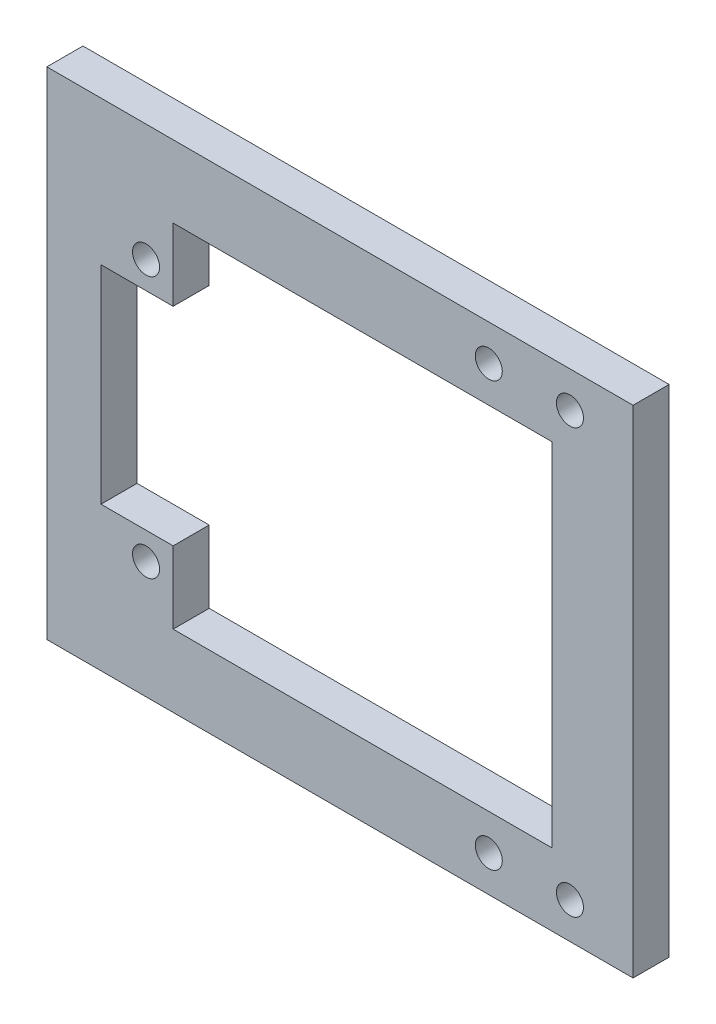
ISO-10303-21;
HEADER;
FILE_DESCRIPTION(('STEP AP214'),'2;1');
FILE_NAME('part.step','',(''),(''),'','','');
FILE_SCHEMA(('AUTOMOTIVE_DESIGN { 1 0 10303 214 1 1 1 1 }'));
ENDSEC;
DATA;
#1=APPLICATION_CONTEXT('core data for automotive mechanical design processes');
#2=APPLICATION_PROTOCOL_DEFINITION('international standard','automotive_design',2000,#1);
#3=PRODUCT_CONTEXT('',#1,'mechanical');
#4=PRODUCT('Part','Part','',(#3));
#5=PRODUCT_RELATED_PRODUCT_CATEGORY('part','',(#4));
#6=PRODUCT_DEFINITION_FORMATION('','',#4);
#7=PRODUCT_DEFINITION_CONTEXT('part definition',#1,'design');
#8=PRODUCT_DEFINITION('design','',#6,#7);
#9=PRODUCT_DEFINITION_SHAPE('','',#8);
#10=(LENGTH_UNIT() NAMED_UNIT(*) SI_UNIT(.MILLI.,.METRE.));
#11=(NAMED_UNIT(*) PLANE_ANGLE_UNIT() SI_UNIT($,.RADIAN.));
#12=(NAMED_UNIT(*) SI_UNIT($,.STERADIAN.) SOLID_ANGLE_UNIT());
#13=UNCERTAINTY_MEASURE_WITH_UNIT(LENGTH_MEASURE(1.E-05),#10,'distance_accuracy_value','');
#14=(GEOMETRIC_REPRESENTATION_CONTEXT(3) GLOBAL_UNCERTAINTY_ASSIGNED_CONTEXT((#13)) GLOBAL_UNIT_ASSIGNED_CONTEXT((#10,
#11,#12)) REPRESENTATION_CONTEXT('',''));
#15=CARTESIAN_POINT('',(0.,0.,0.));
#16=DIRECTION('',(0.,0.,1.));
#17=DIRECTION('',(1.,0.,0.));
#18=AXIS2_PLACEMENT_3D('',#15,#16,#17);
#19=CARTESIAN_POINT('',(0.,0.,4.));
#20=DIRECTION('',(0.,0.,-1.));
#21=DIRECTION('',(-1.,0.,0.));
#22=AXIS2_PLACEMENT_3D('',#19,#20,#21);
#23=PLANE('',#22);
#24=CARTESIAN_POINT('',(25.5,-23.5,4.));
#25=DIRECTION('',(0.,0.,1.));
#26=DIRECTION('',(1.,0.,0.));
#27=AXIS2_PLACEMENT_3D('',#24,#25,#26);
#28=CIRCLE('',#27,1.5);
#29=CARTESIAN_POINT('',(27.,-23.5,4.));
#30=VERTEX_POINT('',#29);
#31=EDGE_CURVE('E191',#30,#30,#28,.T.);
#32=ORIENTED_EDGE('',*,*,#31,.F.);
#33=EDGE_LOOP('',(#32));
#34=FACE_BOUND('',#33,.T.);
#35=CARTESIAN_POINT('',(16.5,-23.5,4.));
#36=DIRECTION('',(0.,0.,1.));
#37=DIRECTION('',(1.,0.,0.));
#38=AXIS2_PLACEMENT_3D('',#35,#36,#37);
#39=CIRCLE('',#38,1.5);
#40=CARTESIAN_POINT('',(18.,-23.5,4.));
#41=VERTEX_POINT('',#40);
#42=EDGE_CURVE('E197',#41,#41,#39,.T.);
#43=ORIENTED_EDGE('',*,*,#42,.F.);
#44=EDGE_LOOP('',(#43));
#45=FACE_BOUND('',#44,.T.);
#46=CARTESIAN_POINT('',(25.5,23.5,4.));
#47=DIRECTION('',(0.,0.,1.));
#48=DIRECTION('',(1.,0.,0.));
#49=AXIS2_PLACEMENT_3D('',#46,#47,#48);
#50=CIRCLE('',#49,1.5);
#51=CARTESIAN_POINT('',(27.,23.5,4.));
#52=VERTEX_POINT('',#51);
#53=EDGE_CURVE('E203',#52,#52,#50,.T.);
#54=ORIENTED_EDGE('',*,*,#53,.F.);
#55=EDGE_LOOP('',(#54));
#56=FACE_BOUND('',#55,.T.);
#57=CARTESIAN_POINT('',(16.5,23.5,4.));
#58=DIRECTION('',(0.,0.,1.));
#59=DIRECTION('',(1.,0.,0.));
#60=AXIS2_PLACEMENT_3D('',#57,#58,#59);
#61=CIRCLE('',#60,1.5);
#62=CARTESIAN_POINT('',(18.,23.5,4.));
#63=VERTEX_POINT('',#62);
#64=EDGE_CURVE('E209',#63,#63,#61,.T.);
#65=ORIENTED_EDGE('',*,*,#64,.F.);
#66=EDGE_LOOP('',(#65));
#67=FACE_BOUND('',#66,.T.);
#68=CARTESIAN_POINT('',(-21.5,-14.5,4.));
#69=DIRECTION('',(0.,0.,1.));
#70=DIRECTION('',(1.,0.,0.));
#71=AXIS2_PLACEMENT_3D('',#68,#69,#70);
#72=CIRCLE('',#71,1.5);
#73=CARTESIAN_POINT('',(-20.,-14.5,4.));
#74=VERTEX_POINT('',#73);
#75=EDGE_CURVE('E215',#74,#74,#72,.T.);
#76=ORIENTED_EDGE('',*,*,#75,.F.);
#77=EDGE_LOOP('',(#76));
#78=FACE_BOUND('',#77,.T.);
#79=CARTESIAN_POINT('',(-21.5,14.5,4.));
#80=DIRECTION('',(0.,0.,1.));
#81=DIRECTION('',(1.,0.,0.));
#82=AXIS2_PLACEMENT_3D('',#79,#80,#81);
#83=CIRCLE('',#82,1.5);
#84=CARTESIAN_POINT('',(-20.,14.5,4.));
#85=VERTEX_POINT('',#84);
#86=EDGE_CURVE('E221',#85,#85,#83,.T.);
#87=ORIENTED_EDGE('',*,*,#86,.F.);
#88=EDGE_LOOP('',(#87));
#89=FACE_BOUND('',#88,.T.);
#90=DIRECTION('',(-1.,0.,0.));
#91=VECTOR('',#90,1.);
#92=CARTESIAN_POINT('',(-32.5,27.5,4.));
#93=LINE('',#92,#91);
#94=CARTESIAN_POINT('',(32.5,27.5,4.));
#95=VERTEX_POINT('',#94);
#96=CARTESIAN_POINT('',(-32.5,27.5,4.));
#97=VERTEX_POINT('',#96);
#98=EDGE_CURVE('E227',#95,#97,#93,.T.);
#99=ORIENTED_EDGE('',*,*,#98,.T.);
#100=DIRECTION('',(0.,-1.,0.));
#101=VECTOR('',#100,1.);
#102=CARTESIAN_POINT('',(-32.5,-27.5,4.));
#103=LINE('',#102,#101);
#104=CARTESIAN_POINT('',(-32.5,-27.5,4.));
#105=VERTEX_POINT('',#104);
#106=EDGE_CURVE('E230',#97,#105,#103,.T.);
#107=ORIENTED_EDGE('',*,*,#106,.T.);
#108=DIRECTION('',(1.,0.,0.));
#109=VECTOR('',#108,1.);
#110=CARTESIAN_POINT('',(32.5,-27.5,4.));
#111=LINE('',#110,#109);
#112=CARTESIAN_POINT('',(32.5,-27.5,4.));
#113=VERTEX_POINT('',#112);
#114=EDGE_CURVE('E233',#105,#113,#111,.T.);
#115=ORIENTED_EDGE('',*,*,#114,.T.);
#116=DIRECTION('',(0.,1.,0.));
#117=VECTOR('',#116,1.);
#118=CARTESIAN_POINT('',(32.5,27.5,4.));
#119=LINE('',#118,#117);
#120=EDGE_CURVE('E235',#113,#95,#119,.T.);
#121=ORIENTED_EDGE('',*,*,#120,.T.);
#122=EDGE_LOOP('',(#99,#107,#115,#121));
#123=FACE_BOUND('',#122,.T.);
#124=DIRECTION('',(1.,0.,0.));
#125=VECTOR('',#124,1.);
#126=CARTESIAN_POINT('',(-18.5,-19.5,4.));
#127=LINE('',#126,#125);
#128=CARTESIAN_POINT('',(-18.5,-19.5,4.));
#129=VERTEX_POINT('',#128);
#130=CARTESIAN_POINT('',(23.5,-19.5,4.));
#131=VERTEX_POINT('',#130);
#132=EDGE_CURVE('E126',#129,#131,#127,.T.);
#133=ORIENTED_EDGE('',*,*,#132,.F.);
#134=DIRECTION('',(0.,-1.,0.));
#135=VECTOR('',#134,1.);
#136=CARTESIAN_POINT('',(-18.5,-11.5,4.));
#137=LINE('',#136,#135);
#138=CARTESIAN_POINT('',(-18.5,-11.5,4.));
#139=VERTEX_POINT('',#138);
#140=EDGE_CURVE('E159',#139,#129,#137,.T.);
#141=ORIENTED_EDGE('',*,*,#140,.F.);
#142=DIRECTION('',(1.,0.,0.));
#143=VECTOR('',#142,1.);
#144=CARTESIAN_POINT('',(-26.5,-11.5,4.));
#145=LINE('',#144,#143);
#146=CARTESIAN_POINT('',(-26.5,-11.5,4.));
#147=VERTEX_POINT('',#146);
#148=EDGE_CURVE('E157',#147,#139,#145,.T.);
#149=ORIENTED_EDGE('',*,*,#148,.F.);
#150=DIRECTION('',(0.,-1.,0.));
#151=VECTOR('',#150,1.);
#152=CARTESIAN_POINT('',(-26.5,11.5,4.));
#153=LINE('',#152,#151);
#154=CARTESIAN_POINT('',(-26.5,11.5,4.));
#155=VERTEX_POINT('',#154);
#156=EDGE_CURVE('E155',#155,#147,#153,.T.);
#157=ORIENTED_EDGE('',*,*,#156,.F.);
#158=DIRECTION('',(-1.,0.,0.));
#159=VECTOR('',#158,1.);
#160=CARTESIAN_POINT('',(-18.5,11.5,4.));
#161=LINE('',#160,#159);
#162=CARTESIAN_POINT('',(-18.5,11.5,4.));
#163=VERTEX_POINT('',#162);
#164=EDGE_CURVE('E153',#163,#155,#161,.T.);
#165=ORIENTED_EDGE('',*,*,#164,.F.);
#166=DIRECTION('',(0.,-1.,0.));
#167=VECTOR('',#166,1.);
#168=CARTESIAN_POINT('',(-18.5,19.5,4.));
#169=LINE('',#168,#167);
#170=CARTESIAN_POINT('',(-18.5,19.5,4.));
#171=VERTEX_POINT('',#170);
#172=EDGE_CURVE('E149',#171,#163,#169,.T.);
#173=ORIENTED_EDGE('',*,*,#172,.F.);
#174=DIRECTION('',(-1.,0.,0.));
#175=VECTOR('',#174,1.);
#176=CARTESIAN_POINT('',(23.5,19.5,4.));
#177=LINE('',#176,#175);
#178=CARTESIAN_POINT('',(23.5,19.5,4.));
#179=VERTEX_POINT('',#178);
#180=EDGE_CURVE('E147',#179,#171,#177,.T.);
#181=ORIENTED_EDGE('',*,*,#180,.F.);
#182=DIRECTION('',(0.,1.,0.));
#183=VECTOR('',#182,1.);
#184=CARTESIAN_POINT('',(23.5,-19.5,4.));
#185=LINE('',#184,#183);
#186=EDGE_CURVE('E134',#131,#179,#185,.T.);
#187=ORIENTED_EDGE('',*,*,#186,.F.);
#188=EDGE_LOOP('',(#133,#141,#149,#157,#165,#173,#181,#187));
#189=FACE_BOUND('',#188,.T.);
#190=ADVANCED_FACE('F37',(#34,#45,#56,#67,#78,#89,#123,#189),#23,.F.);
#191=CARTESIAN_POINT('',(0.,0.,0.));
#192=DIRECTION('',(0.,0.,-1.));
#193=DIRECTION('',(-1.,0.,0.));
#194=AXIS2_PLACEMENT_3D('',#191,#192,#193);
#195=PLANE('',#194);
#196=CARTESIAN_POINT('',(16.5,-23.5,0.));
#197=DIRECTION('',(0.,0.,1.));
#198=DIRECTION('',(1.,0.,0.));
#199=AXIS2_PLACEMENT_3D('',#196,#197,#198);
#200=CIRCLE('',#199,1.5);
#201=CARTESIAN_POINT('',(18.,-23.5,0.));
#202=VERTEX_POINT('',#201);
#203=EDGE_CURVE('E194',#202,#202,#200,.T.);
#204=ORIENTED_EDGE('',*,*,#203,.T.);
#205=EDGE_LOOP('',(#204));
#206=FACE_BOUND('',#205,.T.);
#207=CARTESIAN_POINT('',(16.5,23.5,0.));
#208=DIRECTION('',(0.,0.,1.));
#209=DIRECTION('',(1.,0.,0.));
#210=AXIS2_PLACEMENT_3D('',#207,#208,#209);
#211=CIRCLE('',#210,1.5);
#212=CARTESIAN_POINT('',(18.,23.5,0.));
#213=VERTEX_POINT('',#212);
#214=EDGE_CURVE('E206',#213,#213,#211,.T.);
#215=ORIENTED_EDGE('',*,*,#214,.T.);
#216=EDGE_LOOP('',(#215));
#217=FACE_BOUND('',#216,.T.);
#218=CARTESIAN_POINT('',(-21.5,14.5,0.));
#219=DIRECTION('',(0.,0.,1.));
#220=DIRECTION('',(1.,0.,0.));
#221=AXIS2_PLACEMENT_3D('',#218,#219,#220);
#222=CIRCLE('',#221,1.5);
#223=CARTESIAN_POINT('',(-20.,14.5,0.));
#224=VERTEX_POINT('',#223);
#225=EDGE_CURVE('E218',#224,#224,#222,.T.);
#226=ORIENTED_EDGE('',*,*,#225,.T.);
#227=EDGE_LOOP('',(#226));
#228=FACE_BOUND('',#227,.T.);
#229=DIRECTION('',(-1.,0.,0.));
#230=VECTOR('',#229,1.);
#231=CARTESIAN_POINT('',(-32.5,27.5,0.));
#232=LINE('',#231,#230);
#233=CARTESIAN_POINT('',(32.5,27.5,0.));
#234=VERTEX_POINT('',#233);
#235=CARTESIAN_POINT('',(-32.5,27.5,0.));
#236=VERTEX_POINT('',#235);
#237=EDGE_CURVE('E224',#234,#236,#232,.T.);
#238=ORIENTED_EDGE('',*,*,#237,.F.);
#239=DIRECTION('',(0.,1.,0.));
#240=VECTOR('',#239,1.);
#241=CARTESIAN_POINT('',(32.5,27.5,0.));
#242=LINE('',#241,#240);
#243=CARTESIAN_POINT('',(32.5,-27.5,0.));
#244=VERTEX_POINT('',#243);
#245=EDGE_CURVE('E231',#244,#234,#242,.T.);
#246=ORIENTED_EDGE('',*,*,#245,.F.);
#247=DIRECTION('',(1.,0.,0.));
#248=VECTOR('',#247,1.);
#249=CARTESIAN_POINT('',(32.5,-27.5,0.));
#250=LINE('',#249,#248);
#251=CARTESIAN_POINT('',(-32.5,-27.5,0.));
#252=VERTEX_POINT('',#251);
#253=EDGE_CURVE('E242',#252,#244,#250,.T.);
#254=ORIENTED_EDGE('',*,*,#253,.F.);
#255=DIRECTION('',(0.,-1.,0.));
#256=VECTOR('',#255,1.);
#257=CARTESIAN_POINT('',(-32.5,-27.5,0.));
#258=LINE('',#257,#256);
#259=EDGE_CURVE('E240',#236,#252,#258,.T.);
#260=ORIENTED_EDGE('',*,*,#259,.F.);
#261=EDGE_LOOP('',(#238,#246,#254,#260));
#262=FACE_BOUND('',#261,.T.);
#263=CARTESIAN_POINT('',(-21.5,-14.5,0.));
#264=DIRECTION('',(0.,0.,1.));
#265=DIRECTION('',(1.,0.,0.));
#266=AXIS2_PLACEMENT_3D('',#263,#264,#265);
#267=CIRCLE('',#266,1.5);
#268=CARTESIAN_POINT('',(-20.,-14.5,0.));
#269=VERTEX_POINT('',#268);
#270=EDGE_CURVE('E212',#269,#269,#267,.T.);
#271=ORIENTED_EDGE('',*,*,#270,.T.);
#272=EDGE_LOOP('',(#271));
#273=FACE_BOUND('',#272,.T.);
#274=CARTESIAN_POINT('',(25.5,23.5,0.));
#275=DIRECTION('',(0.,0.,1.));
#276=DIRECTION('',(1.,0.,0.));
#277=AXIS2_PLACEMENT_3D('',#274,#275,#276);
#278=CIRCLE('',#277,1.5);
#279=CARTESIAN_POINT('',(27.,23.5,0.));
#280=VERTEX_POINT('',#279);
#281=EDGE_CURVE('E200',#280,#280,#278,.T.);
#282=ORIENTED_EDGE('',*,*,#281,.T.);
#283=EDGE_LOOP('',(#282));
#284=FACE_BOUND('',#283,.T.);
#285=CARTESIAN_POINT('',(25.5,-23.5,0.));
#286=DIRECTION('',(0.,0.,1.));
#287=DIRECTION('',(1.,0.,0.));
#288=AXIS2_PLACEMENT_3D('',#285,#286,#287);
#289=CIRCLE('',#288,1.5);
#290=CARTESIAN_POINT('',(27.,-23.5,0.));
#291=VERTEX_POINT('',#290);
#292=EDGE_CURVE('E142',#291,#291,#289,.T.);
#293=ORIENTED_EDGE('',*,*,#292,.T.);
#294=EDGE_LOOP('',(#293));
#295=FACE_BOUND('',#294,.T.);
#296=DIRECTION('',(0.,-1.,0.));
#297=VECTOR('',#296,1.);
#298=CARTESIAN_POINT('',(-18.5,-11.5,0.));
#299=LINE('',#298,#297);
#300=CARTESIAN_POINT('',(-18.5,-11.5,0.));
#301=VERTEX_POINT('',#300);
#302=CARTESIAN_POINT('',(-18.5,-19.5,0.));
#303=VERTEX_POINT('',#302);
#304=EDGE_CURVE('E135',#301,#303,#299,.T.);
#305=ORIENTED_EDGE('',*,*,#304,.T.);
#306=DIRECTION('',(1.,0.,0.));
#307=VECTOR('',#306,1.);
#308=CARTESIAN_POINT('',(-18.5,-19.5,0.));
#309=LINE('',#308,#307);
#310=CARTESIAN_POINT('',(23.5,-19.5,0.));
#311=VERTEX_POINT('',#310);
#312=EDGE_CURVE('E60',#303,#311,#309,.T.);
#313=ORIENTED_EDGE('',*,*,#312,.T.);
#314=DIRECTION('',(0.,1.,0.));
#315=VECTOR('',#314,1.);
#316=CARTESIAN_POINT('',(23.5,-19.5,0.));
#317=LINE('',#316,#315);
#318=CARTESIAN_POINT('',(23.5,19.5,0.));
#319=VERTEX_POINT('',#318);
#320=EDGE_CURVE('E141',#311,#319,#317,.T.);
#321=ORIENTED_EDGE('',*,*,#320,.T.);
#322=DIRECTION('',(-1.,0.,0.));
#323=VECTOR('',#322,1.);
#324=CARTESIAN_POINT('',(23.5,19.5,0.));
#325=LINE('',#324,#323);
#326=CARTESIAN_POINT('',(-18.5,19.5,0.));
#327=VERTEX_POINT('',#326);
#328=EDGE_CURVE('E163',#319,#327,#325,.T.);
#329=ORIENTED_EDGE('',*,*,#328,.T.);
#330=DIRECTION('',(0.,-1.,0.));
#331=VECTOR('',#330,1.);
#332=CARTESIAN_POINT('',(-18.5,19.5,0.));
#333=LINE('',#332,#331);
#334=CARTESIAN_POINT('',(-18.5,11.5,0.));
#335=VERTEX_POINT('',#334);
#336=EDGE_CURVE('E166',#327,#335,#333,.T.);
#337=ORIENTED_EDGE('',*,*,#336,.T.);
#338=DIRECTION('',(-1.,0.,0.));
#339=VECTOR('',#338,1.);
#340=CARTESIAN_POINT('',(-18.5,11.5,0.));
#341=LINE('',#340,#339);
#342=CARTESIAN_POINT('',(-26.5,11.5,0.));
#343=VERTEX_POINT('',#342);
#344=EDGE_CURVE('E169',#335,#343,#341,.T.);
#345=ORIENTED_EDGE('',*,*,#344,.T.);
#346=DIRECTION('',(0.,-1.,0.));
#347=VECTOR('',#346,1.);
#348=CARTESIAN_POINT('',(-26.5,11.5,0.));
#349=LINE('',#348,#347);
#350=CARTESIAN_POINT('',(-26.5,-11.5,0.));
#351=VERTEX_POINT('',#350);
#352=EDGE_CURVE('E172',#343,#351,#349,.T.);
#353=ORIENTED_EDGE('',*,*,#352,.T.);
#354=DIRECTION('',(1.,0.,0.));
#355=VECTOR('',#354,1.);
#356=CARTESIAN_POINT('',(-26.5,-11.5,0.));
#357=LINE('',#356,#355);
#358=EDGE_CURVE('E175',#351,#301,#357,.T.);
#359=ORIENTED_EDGE('',*,*,#358,.T.);
#360=EDGE_LOOP('',(#305,#313,#321,#329,#337,#345,#353,#359));
#361=FACE_BOUND('',#360,.T.);
#362=ADVANCED_FACE('F260',(#206,#217,#228,#262,#273,#284,#295,#361),#195,.T.);
#363=CARTESIAN_POINT('',(-32.5,27.5,4.));
#364=DIRECTION('',(0.,-1.,0.));
#365=DIRECTION('',(1.,0.,0.));
#366=AXIS2_PLACEMENT_3D('',#363,#364,#365);
#367=PLANE('',#366);
#368=ORIENTED_EDGE('',*,*,#237,.T.);
#369=DIRECTION('',(0.,0.,-1.));
#370=VECTOR('',#369,1.);
#371=CARTESIAN_POINT('',(-32.5,27.5,4.));
#372=LINE('',#371,#370);
#373=EDGE_CURVE('E11',#97,#236,#372,.T.);
#374=ORIENTED_EDGE('',*,*,#373,.F.);
#375=ORIENTED_EDGE('',*,*,#98,.F.);
#376=DIRECTION('',(0.,0.,-1.));
#377=VECTOR('',#376,1.);
#378=CARTESIAN_POINT('',(32.5,27.5,4.));
#379=LINE('',#378,#377);
#380=EDGE_CURVE('E237',#95,#234,#379,.T.);
#381=ORIENTED_EDGE('',*,*,#380,.T.);
#382=EDGE_LOOP('',(#368,#374,#375,#381));
#383=FACE_BOUND('',#382,.T.);
#384=ADVANCED_FACE('F39',(#383),#367,.F.);
#385=CARTESIAN_POINT('',(-32.5,-27.5,4.));
#386=DIRECTION('',(1.,0.,0.));
#387=DIRECTION('',(0.,1.,0.));
#388=AXIS2_PLACEMENT_3D('',#385,#386,#387);
#389=PLANE('',#388);
#390=ORIENTED_EDGE('',*,*,#259,.T.);
#391=DIRECTION('',(0.,0.,-1.));
#392=VECTOR('',#391,1.);
#393=CARTESIAN_POINT('',(-32.5,-27.5,4.));
#394=LINE('',#393,#392);
#395=EDGE_CURVE('E45',#105,#252,#394,.T.);
#396=ORIENTED_EDGE('',*,*,#395,.F.);
#397=ORIENTED_EDGE('',*,*,#106,.F.);
#398=ORIENTED_EDGE('',*,*,#373,.T.);
#399=EDGE_LOOP('',(#390,#396,#397,#398));
#400=FACE_BOUND('',#399,.T.);
#401=ADVANCED_FACE('F270',(#400),#389,.F.);
#402=CARTESIAN_POINT('',(32.5,-27.5,4.));
#403=DIRECTION('',(0.,1.,0.));
#404=DIRECTION('',(-1.,0.,0.));
#405=AXIS2_PLACEMENT_3D('',#402,#403,#404);
#406=PLANE('',#405);
#407=ORIENTED_EDGE('',*,*,#253,.T.);
#408=DIRECTION('',(0.,0.,-1.));
#409=VECTOR('',#408,1.);
#410=CARTESIAN_POINT('',(32.5,-27.5,4.));
#411=LINE('',#410,#409);
#412=EDGE_CURVE('E247',#113,#244,#411,.T.);
#413=ORIENTED_EDGE('',*,*,#412,.F.);
#414=ORIENTED_EDGE('',*,*,#114,.F.);
#415=ORIENTED_EDGE('',*,*,#395,.T.);
#416=EDGE_LOOP('',(#407,#413,#414,#415));
#417=FACE_BOUND('',#416,.T.);
#418=ADVANCED_FACE('F254',(#417),#406,.F.);
#419=CARTESIAN_POINT('',(32.5,27.5,4.));
#420=DIRECTION('',(-1.,0.,0.));
#421=DIRECTION('',(0.,-1.,0.));
#422=AXIS2_PLACEMENT_3D('',#419,#420,#421);
#423=PLANE('',#422);
#424=ORIENTED_EDGE('',*,*,#245,.T.);
#425=ORIENTED_EDGE('',*,*,#380,.F.);
#426=ORIENTED_EDGE('',*,*,#120,.F.);
#427=ORIENTED_EDGE('',*,*,#412,.T.);
#428=EDGE_LOOP('',(#424,#425,#426,#427));
#429=FACE_BOUND('',#428,.T.);
#430=ADVANCED_FACE('F264',(#429),#423,.F.);
#431=CARTESIAN_POINT('',(-21.5,14.5,4.));
#432=DIRECTION('',(0.,0.,-1.));
#433=DIRECTION('',(-1.,0.,0.));
#434=AXIS2_PLACEMENT_3D('',#431,#432,#433);
#435=CYLINDRICAL_SURFACE('',#434,1.5);
#436=ORIENTED_EDGE('',*,*,#86,.T.);
#437=EDGE_LOOP('',(#436));
#438=FACE_BOUND('',#437,.T.);
#439=ORIENTED_EDGE('',*,*,#225,.F.);
#440=EDGE_LOOP('',(#439));
#441=FACE_BOUND('',#440,.T.);
#442=ADVANCED_FACE('F288',(#438,#441),#435,.F.);
#443=CARTESIAN_POINT('',(-21.5,-14.5,4.));
#444=DIRECTION('',(0.,0.,-1.));
#445=DIRECTION('',(-1.,0.,0.));
#446=AXIS2_PLACEMENT_3D('',#443,#444,#445);
#447=CYLINDRICAL_SURFACE('',#446,1.5);
#448=ORIENTED_EDGE('',*,*,#75,.T.);
#449=EDGE_LOOP('',(#448));
#450=FACE_BOUND('',#449,.T.);
#451=ORIENTED_EDGE('',*,*,#270,.F.);
#452=EDGE_LOOP('',(#451));
#453=FACE_BOUND('',#452,.T.);
#454=ADVANCED_FACE('F295',(#450,#453),#447,.F.);
#455=CARTESIAN_POINT('',(16.5,23.5,4.));
#456=DIRECTION('',(0.,0.,-1.));
#457=DIRECTION('',(-1.,0.,0.));
#458=AXIS2_PLACEMENT_3D('',#455,#456,#457);
#459=CYLINDRICAL_SURFACE('',#458,1.5);
#460=ORIENTED_EDGE('',*,*,#64,.T.);
#461=EDGE_LOOP('',(#460));
#462=FACE_BOUND('',#461,.T.);
#463=ORIENTED_EDGE('',*,*,#214,.F.);
#464=EDGE_LOOP('',(#463));
#465=FACE_BOUND('',#464,.T.);
#466=ADVANCED_FACE('F300',(#462,#465),#459,.F.);
#467=CARTESIAN_POINT('',(25.5,23.5,4.));
#468=DIRECTION('',(0.,0.,-1.));
#469=DIRECTION('',(-1.,0.,0.));
#470=AXIS2_PLACEMENT_3D('',#467,#468,#469);
#471=CYLINDRICAL_SURFACE('',#470,1.5);
#472=ORIENTED_EDGE('',*,*,#53,.T.);
#473=EDGE_LOOP('',(#472));
#474=FACE_BOUND('',#473,.T.);
#475=ORIENTED_EDGE('',*,*,#281,.F.);
#476=EDGE_LOOP('',(#475));
#477=FACE_BOUND('',#476,.T.);
#478=ADVANCED_FACE('F310',(#474,#477),#471,.F.);
#479=CARTESIAN_POINT('',(16.5,-23.5,4.));
#480=DIRECTION('',(0.,0.,-1.));
#481=DIRECTION('',(-1.,0.,0.));
#482=AXIS2_PLACEMENT_3D('',#479,#480,#481);
#483=CYLINDRICAL_SURFACE('',#482,1.5);
#484=ORIENTED_EDGE('',*,*,#42,.T.);
#485=EDGE_LOOP('',(#484));
#486=FACE_BOUND('',#485,.T.);
#487=ORIENTED_EDGE('',*,*,#203,.F.);
#488=EDGE_LOOP('',(#487));
#489=FACE_BOUND('',#488,.T.);
#490=ADVANCED_FACE('F317',(#486,#489),#483,.F.);
#491=CARTESIAN_POINT('',(25.5,-23.5,4.));
#492=DIRECTION('',(0.,0.,-1.));
#493=DIRECTION('',(-1.,0.,0.));
#494=AXIS2_PLACEMENT_3D('',#491,#492,#493);
#495=CYLINDRICAL_SURFACE('',#494,1.5);
#496=ORIENTED_EDGE('',*,*,#31,.T.);
#497=EDGE_LOOP('',(#496));
#498=FACE_BOUND('',#497,.T.);
#499=ORIENTED_EDGE('',*,*,#292,.F.);
#500=EDGE_LOOP('',(#499));
#501=FACE_BOUND('',#500,.T.);
#502=ADVANCED_FACE('F321',(#498,#501),#495,.F.);
#503=CARTESIAN_POINT('',(-18.5,-19.5,4.));
#504=DIRECTION('',(0.,1.,0.));
#505=DIRECTION('',(-1.,0.,0.));
#506=AXIS2_PLACEMENT_3D('',#503,#504,#505);
#507=PLANE('',#506);
#508=ORIENTED_EDGE('',*,*,#312,.F.);
#509=DIRECTION('',(0.,0.,-1.));
#510=VECTOR('',#509,1.);
#511=CARTESIAN_POINT('',(-18.5,-19.5,4.));
#512=LINE('',#511,#510);
#513=EDGE_CURVE('E130',#129,#303,#512,.T.);
#514=ORIENTED_EDGE('',*,*,#513,.F.);
#515=ORIENTED_EDGE('',*,*,#132,.T.);
#516=DIRECTION('',(0.,0.,-1.));
#517=VECTOR('',#516,1.);
#518=CARTESIAN_POINT('',(23.5,-19.5,4.));
#519=LINE('',#518,#517);
#520=EDGE_CURVE('E129',#131,#311,#519,.T.);
#521=ORIENTED_EDGE('',*,*,#520,.T.);
#522=EDGE_LOOP('',(#508,#514,#515,#521));
#523=FACE_BOUND('',#522,.T.);
#524=ADVANCED_FACE('F128',(#523),#507,.T.);
#525=CARTESIAN_POINT('',(23.5,-19.5,4.));
#526=DIRECTION('',(-1.,0.,0.));
#527=DIRECTION('',(0.,-1.,0.));
#528=AXIS2_PLACEMENT_3D('',#525,#526,#527);
#529=PLANE('',#528);
#530=ORIENTED_EDGE('',*,*,#320,.F.);
#531=ORIENTED_EDGE('',*,*,#520,.F.);
#532=ORIENTED_EDGE('',*,*,#186,.T.);
#533=DIRECTION('',(0.,0.,-1.));
#534=VECTOR('',#533,1.);
#535=CARTESIAN_POINT('',(23.5,19.5,4.));
#536=LINE('',#535,#534);
#537=EDGE_CURVE('E143',#179,#319,#536,.T.);
#538=ORIENTED_EDGE('',*,*,#537,.T.);
#539=EDGE_LOOP('',(#530,#531,#532,#538));
#540=FACE_BOUND('',#539,.T.);
#541=ADVANCED_FACE('F138',(#540),#529,.T.);
#542=CARTESIAN_POINT('',(23.5,19.5,4.));
#543=DIRECTION('',(0.,-1.,0.));
#544=DIRECTION('',(1.,0.,0.));
#545=AXIS2_PLACEMENT_3D('',#542,#543,#544);
#546=PLANE('',#545);
#547=ORIENTED_EDGE('',*,*,#328,.F.);
#548=ORIENTED_EDGE('',*,*,#537,.F.);
#549=ORIENTED_EDGE('',*,*,#180,.T.);
#550=DIRECTION('',(0.,0.,-1.));
#551=VECTOR('',#550,1.);
#552=CARTESIAN_POINT('',(-18.5,19.5,4.));
#553=LINE('',#552,#551);
#554=EDGE_CURVE('E188',#171,#327,#553,.T.);
#555=ORIENTED_EDGE('',*,*,#554,.T.);
#556=EDGE_LOOP('',(#547,#548,#549,#555));
#557=FACE_BOUND('',#556,.T.);
#558=ADVANCED_FACE('F330',(#557),#546,.T.);
#559=CARTESIAN_POINT('',(-18.5,19.5,4.));
#560=DIRECTION('',(1.,0.,0.));
#561=DIRECTION('',(0.,1.,0.));
#562=AXIS2_PLACEMENT_3D('',#559,#560,#561);
#563=PLANE('',#562);
#564=ORIENTED_EDGE('',*,*,#336,.F.);
#565=ORIENTED_EDGE('',*,*,#554,.F.);
#566=ORIENTED_EDGE('',*,*,#172,.T.);
#567=DIRECTION('',(0.,0.,-1.));
#568=VECTOR('',#567,1.);
#569=CARTESIAN_POINT('',(-18.5,11.5,4.));
#570=LINE('',#569,#568);
#571=EDGE_CURVE('E186',#163,#335,#570,.T.);
#572=ORIENTED_EDGE('',*,*,#571,.T.);
#573=EDGE_LOOP('',(#564,#565,#566,#572));
#574=FACE_BOUND('',#573,.T.);
#575=ADVANCED_FACE('F333',(#574),#563,.T.);
#576=CARTESIAN_POINT('',(-18.5,11.5,4.));
#577=DIRECTION('',(0.,-1.,0.));
#578=DIRECTION('',(1.,0.,0.));
#579=AXIS2_PLACEMENT_3D('',#576,#577,#578);
#580=PLANE('',#579);
#581=ORIENTED_EDGE('',*,*,#344,.F.);
#582=ORIENTED_EDGE('',*,*,#571,.F.);
#583=ORIENTED_EDGE('',*,*,#164,.T.);
#584=DIRECTION('',(0.,0.,-1.));
#585=VECTOR('',#584,1.);
#586=CARTESIAN_POINT('',(-26.5,11.5,4.));
#587=LINE('',#586,#585);
#588=EDGE_CURVE('E184',#155,#343,#587,.T.);
#589=ORIENTED_EDGE('',*,*,#588,.T.);
#590=EDGE_LOOP('',(#581,#582,#583,#589));
#591=FACE_BOUND('',#590,.T.);
#592=ADVANCED_FACE('F337',(#591),#580,.T.);
#593=CARTESIAN_POINT('',(-26.5,11.5,4.));
#594=DIRECTION('',(1.,0.,0.));
#595=DIRECTION('',(0.,1.,0.));
#596=AXIS2_PLACEMENT_3D('',#593,#594,#595);
#597=PLANE('',#596);
#598=ORIENTED_EDGE('',*,*,#352,.F.);
#599=ORIENTED_EDGE('',*,*,#588,.F.);
#600=ORIENTED_EDGE('',*,*,#156,.T.);
#601=DIRECTION('',(0.,0.,-1.));
#602=VECTOR('',#601,1.);
#603=CARTESIAN_POINT('',(-26.5,-11.5,4.));
#604=LINE('',#603,#602);
#605=EDGE_CURVE('E182',#147,#351,#604,.T.);
#606=ORIENTED_EDGE('',*,*,#605,.T.);
#607=EDGE_LOOP('',(#598,#599,#600,#606));
#608=FACE_BOUND('',#607,.T.);
#609=ADVANCED_FACE('F341',(#608),#597,.T.);
#610=CARTESIAN_POINT('',(-26.5,-11.5,4.));
#611=DIRECTION('',(0.,1.,0.));
#612=DIRECTION('',(-1.,0.,0.));
#613=AXIS2_PLACEMENT_3D('',#610,#611,#612);
#614=PLANE('',#613);
#615=ORIENTED_EDGE('',*,*,#358,.F.);
#616=ORIENTED_EDGE('',*,*,#605,.F.);
#617=ORIENTED_EDGE('',*,*,#148,.T.);
#618=DIRECTION('',(0.,0.,-1.));
#619=VECTOR('',#618,1.);
#620=CARTESIAN_POINT('',(-18.5,-11.5,4.));
#621=LINE('',#620,#619);
#622=EDGE_CURVE('E52',#139,#301,#621,.T.);
#623=ORIENTED_EDGE('',*,*,#622,.T.);
#624=EDGE_LOOP('',(#615,#616,#617,#623));
#625=FACE_BOUND('',#624,.T.);
#626=ADVANCED_FACE('F345',(#625),#614,.T.);
#627=CARTESIAN_POINT('',(-18.5,-11.5,4.));
#628=DIRECTION('',(1.,0.,0.));
#629=DIRECTION('',(0.,0.,-1.));
#630=AXIS2_PLACEMENT_3D('',#627,#628,#629);
#631=PLANE('',#630);
#632=ORIENTED_EDGE('',*,*,#304,.F.);
#633=ORIENTED_EDGE('',*,*,#622,.F.);
#634=ORIENTED_EDGE('',*,*,#140,.T.);
#635=ORIENTED_EDGE('',*,*,#513,.T.);
#636=EDGE_LOOP('',(#632,#633,#634,#635));
#637=FACE_BOUND('',#636,.T.);
#638=ADVANCED_FACE('F349',(#637),#631,.T.);
#639=CLOSED_SHELL('',(#190,#362,#384,#401,#418,#430,#442,#454,#466,#478,#490,#502,#524,#541,
#558,#575,#592,#609,#626,#638));
#640=MANIFOLD_SOLID_BREP('B2',#639);
#641=ADVANCED_BREP_SHAPE_REPRESENTATION('',(#18,#640),#14);
#642=SHAPE_DEFINITION_REPRESENTATION(#9,#641);
ENDSEC;
END-ISO-10303-21;
